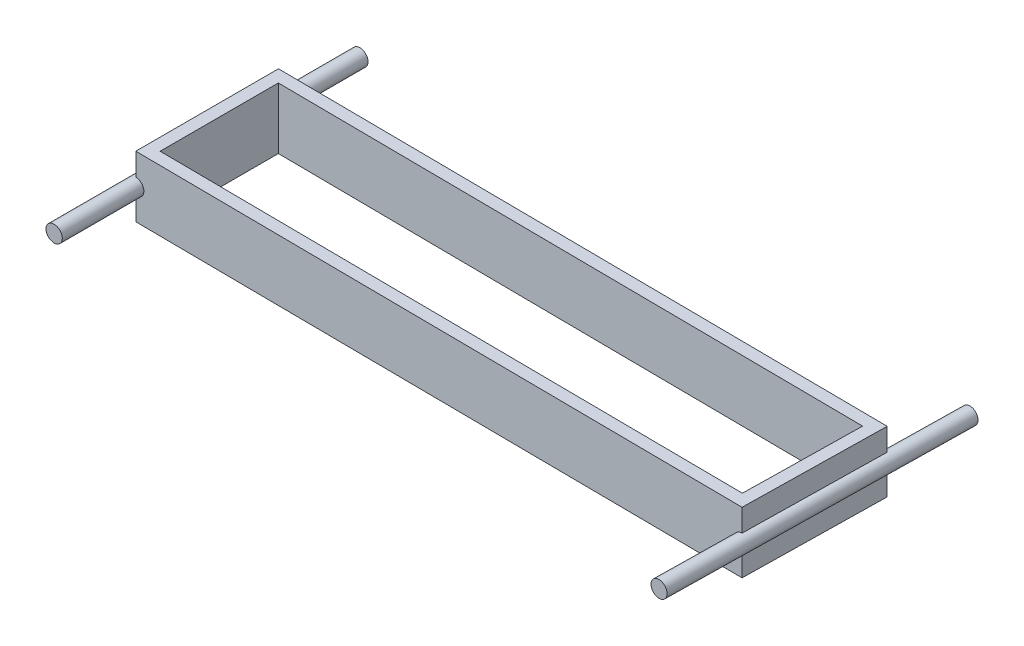
ISO-10303-21;
HEADER;
FILE_DESCRIPTION(('STEP AP214'),'2;1');
FILE_NAME('part.step','',(''),(''),'','','');
FILE_SCHEMA(('AUTOMOTIVE_DESIGN { 1 0 10303 214 1 1 1 1 }'));
ENDSEC;
DATA;
#1=APPLICATION_CONTEXT('core data for automotive mechanical design processes');
#2=APPLICATION_PROTOCOL_DEFINITION('international standard','automotive_design',2000,#1);
#3=PRODUCT_CONTEXT('',#1,'mechanical');
#4=PRODUCT('Part','Part','',(#3));
#5=PRODUCT_RELATED_PRODUCT_CATEGORY('part','',(#4));
#6=PRODUCT_DEFINITION_FORMATION('','',#4);
#7=PRODUCT_DEFINITION_CONTEXT('part definition',#1,'design');
#8=PRODUCT_DEFINITION('design','',#6,#7);
#9=PRODUCT_DEFINITION_SHAPE('','',#8);
#10=(LENGTH_UNIT() NAMED_UNIT(*) SI_UNIT(.MILLI.,.METRE.));
#11=(NAMED_UNIT(*) PLANE_ANGLE_UNIT() SI_UNIT($,.RADIAN.));
#12=(NAMED_UNIT(*) SI_UNIT($,.STERADIAN.) SOLID_ANGLE_UNIT());
#13=UNCERTAINTY_MEASURE_WITH_UNIT(LENGTH_MEASURE(1.E-05),#10,'distance_accuracy_value','');
#14=(GEOMETRIC_REPRESENTATION_CONTEXT(3) GLOBAL_UNCERTAINTY_ASSIGNED_CONTEXT((#13)) GLOBAL_UNIT_ASSIGNED_CONTEXT((#10,
#11,#12)) REPRESENTATION_CONTEXT('',''));
#15=CARTESIAN_POINT('',(0.,0.,0.));
#16=DIRECTION('',(0.,0.,1.));
#17=DIRECTION('',(1.,0.,0.));
#18=AXIS2_PLACEMENT_3D('',#15,#16,#17);
#19=CARTESIAN_POINT('',(57.4764554957129,-38.1,47.6503976005719));
#20=DIRECTION('',(0.99985306122449,0.,0.0171422273936795));
#21=DIRECTION('',(0.0171422273936795,0.,-0.99985306122449));
#22=AXIS2_PLACEMENT_3D('',#19,#20,#21);
#23=PLANE('',#22);
#24=DIRECTION('',(0.0171422273936795,0.,-0.99985306122449));
#25=VECTOR('',#24,1.);
#26=CARTESIAN_POINT('',(56.6045106706446,-24.13,98.5082401983644));
#27=LINE('',#26,#25);
#28=CARTESIAN_POINT('',(57.4764554957129,-24.13,47.6503976005719));
#29=VERTEX_POINT('',#28);
#30=CARTESIAN_POINT('',(59.000399511011,-24.13,-41.2365395422852));
#31=VERTEX_POINT('',#30);
#32=EDGE_CURVE('E137',#29,#31,#27,.T.);
#33=ORIENTED_EDGE('',*,*,#32,.F.);
#34=DIRECTION('',(0.,1.,0.));
#35=VECTOR('',#34,1.);
#36=CARTESIAN_POINT('',(57.4764554957129,-38.1,47.6503976005719));
#37=LINE('',#36,#35);
#38=CARTESIAN_POINT('',(57.4764554957129,-38.1,47.6503976005719));
#39=VERTEX_POINT('',#38);
#40=EDGE_CURVE('E125',#39,#29,#37,.T.);
#41=ORIENTED_EDGE('',*,*,#40,.F.);
#42=DIRECTION('',(0.0171422273936795,0.,-0.99985306122449));
#43=VECTOR('',#42,1.);
#44=CARTESIAN_POINT('',(57.4764554957129,-38.1,47.6503976005719));
#45=LINE('',#44,#43);
#46=CARTESIAN_POINT('',(59.000399511011,-38.1,-41.2365395422852));
#47=VERTEX_POINT('',#46);
#48=EDGE_CURVE('E204',#39,#47,#45,.T.);
#49=ORIENTED_EDGE('',*,*,#48,.T.);
#50=DIRECTION('',(0.,1.,0.));
#51=VECTOR('',#50,1.);
#52=CARTESIAN_POINT('',(59.000399511011,-38.1,-41.2365395422852));
#53=LINE('',#52,#51);
#54=EDGE_CURVE('E138',#47,#31,#53,.T.);
#55=ORIENTED_EDGE('',*,*,#54,.T.);
#56=EDGE_LOOP('',(#33,#41,#49,#55));
#57=FACE_BOUND('',#56,.T.);
#58=ADVANCED_FACE('F36',(#57),#23,.T.);
#59=CARTESIAN_POINT('',(-323.509548328842,-38.1,44.3846833148531));
#60=DIRECTION('',(-1.,0.,0.));
#61=DIRECTION('',(0.,0.,1.));
#62=AXIS2_PLACEMENT_3D('',#59,#60,#61);
#63=PLANE('',#62);
#64=DIRECTION('',(0.,1.,0.));
#65=VECTOR('',#64,1.);
#66=CARTESIAN_POINT('',(-323.509548328842,-38.1,-44.5153166851469));
#67=LINE('',#66,#65);
#68=CARTESIAN_POINT('',(-323.509548328842,-13.97,-44.5153166851469));
#69=VERTEX_POINT('',#68);
#70=CARTESIAN_POINT('',(-323.509548328842,0.,-44.5153166851469));
#71=VERTEX_POINT('',#70);
#72=EDGE_CURVE('E223',#69,#71,#67,.T.);
#73=ORIENTED_EDGE('',*,*,#72,.F.);
#74=DIRECTION('',(0.,0.,-1.));
#75=VECTOR('',#74,1.);
#76=CARTESIAN_POINT('',(-323.509548328842,-13.97,95.25));
#77=LINE('',#76,#75);
#78=CARTESIAN_POINT('',(-323.509548328842,-13.9700000000001,44.3846833148531));
#79=VERTEX_POINT('',#78);
#80=EDGE_CURVE('E160',#69,#79,#77,.F.);
#81=ORIENTED_EDGE('',*,*,#80,.T.);
#82=DIRECTION('',(0.,1.,0.));
#83=VECTOR('',#82,1.);
#84=CARTESIAN_POINT('',(-323.509548328842,-38.1,44.3846833148531));
#85=LINE('',#84,#83);
#86=CARTESIAN_POINT('',(-323.509548328842,0.,44.3846833148531));
#87=VERTEX_POINT('',#86);
#88=EDGE_CURVE('E209',#79,#87,#85,.T.);
#89=ORIENTED_EDGE('',*,*,#88,.T.);
#90=DIRECTION('',(0.,0.,1.));
#91=VECTOR('',#90,1.);
#92=CARTESIAN_POINT('',(-323.509548328842,0.,44.3846833148531));
#93=LINE('',#92,#91);
#94=EDGE_CURVE('E192',#71,#87,#93,.T.);
#95=ORIENTED_EDGE('',*,*,#94,.F.);
#96=EDGE_LOOP('',(#73,#81,#89,#95));
#97=FACE_BOUND('',#96,.T.);
#98=ADVANCED_FACE('F38',(#97),#63,.T.);
#99=CARTESIAN_POINT('',(-323.509548328842,-38.1,44.3846833148531));
#100=VERTEX_POINT('',#99);
#101=CARTESIAN_POINT('',(-323.509548328842,-24.13,44.3846833148531));
#102=VERTEX_POINT('',#101);
#103=EDGE_CURVE('E225',#100,#102,#85,.T.);
#104=ORIENTED_EDGE('',*,*,#103,.T.);
#105=DIRECTION('',(0.,0.,-1.));
#106=VECTOR('',#105,1.);
#107=CARTESIAN_POINT('',(-323.509548328842,-24.13,95.25));
#108=LINE('',#107,#106);
#109=CARTESIAN_POINT('',(-323.509548328842,-24.13,-44.5153166851469));
#110=VERTEX_POINT('',#109);
#111=EDGE_CURVE('E155',#102,#110,#108,.T.);
#112=ORIENTED_EDGE('',*,*,#111,.T.);
#113=CARTESIAN_POINT('',(-323.509548328842,-38.1,-44.5153166851469));
#114=VERTEX_POINT('',#113);
#115=EDGE_CURVE('E220',#114,#110,#67,.T.);
#116=ORIENTED_EDGE('',*,*,#115,.F.);
#117=DIRECTION('',(0.,0.,1.));
#118=VECTOR('',#117,1.);
#119=CARTESIAN_POINT('',(-323.509548328842,-38.1,44.3846833148531));
#120=LINE('',#119,#118);
#121=EDGE_CURVE('E199',#114,#100,#120,.T.);
#122=ORIENTED_EDGE('',*,*,#121,.T.);
#123=EDGE_LOOP('',(#104,#112,#116,#122));
#124=FACE_BOUND('',#123,.T.);
#125=ADVANCED_FACE('F232',(#124),#63,.T.);
#126=CARTESIAN_POINT('',(-323.509548328842,-38.1,-44.5153166851469));
#127=DIRECTION('',(0.00857142857144036,0.,-0.999963264631379));
#128=DIRECTION('',(-0.999963264631379,0.,-0.00857142857144036));
#129=AXIS2_PLACEMENT_3D('',#126,#127,#128);
#130=PLANE('',#129);
#131=CARTESIAN_POINT('',(59.0003995110107,-19.05,-41.2365395422852));
#132=DIRECTION('',(0.00857142857144036,0.,-0.999963264631379));
#133=DIRECTION('',(0.999963264631379,0.,0.00857142857144036));
#134=AXIS2_PLACEMENT_3D('',#131,#132,#133);
#135=ELLIPSE('',#134,5.0801866225282,5.07999999999996);
#136=CARTESIAN_POINT('',(59.000399511011,-13.97,-41.2365395422852));
#137=VERTEX_POINT('',#136);
#138=EDGE_CURVE('E58',#31,#137,#135,.T.);
#139=ORIENTED_EDGE('',*,*,#138,.F.);
#140=ORIENTED_EDGE('',*,*,#54,.F.);
#141=DIRECTION('',(-0.999963264631379,0.,-0.00857142857144036));
#142=VECTOR('',#141,1.);
#143=CARTESIAN_POINT('',(-323.509548328842,-38.1,-44.5153166851469));
#144=LINE('',#143,#142);
#145=EDGE_CURVE('E206',#47,#114,#144,.T.);
#146=ORIENTED_EDGE('',*,*,#145,.T.);
#147=ORIENTED_EDGE('',*,*,#115,.T.);
#148=CARTESIAN_POINT('',(-323.509548328842,-19.05,-44.5153166851469));
#149=DIRECTION('',(0.00857142857144036,0.,-0.999963264631379));
#150=DIRECTION('',(-0.999963264631379,0.,-0.00857142857144036));
#151=AXIS2_PLACEMENT_3D('',#148,#149,#150);
#152=ELLIPSE('',#151,5.08018662252821,5.07999999999996);
#153=EDGE_CURVE('E163',#110,#69,#152,.F.);
#154=ORIENTED_EDGE('',*,*,#153,.T.);
#155=ORIENTED_EDGE('',*,*,#72,.T.);
#156=DIRECTION('',(-0.999963264631379,0.,-0.00857142857144036));
#157=VECTOR('',#156,1.);
#158=CARTESIAN_POINT('',(-323.509548328842,0.,-44.5153166851469));
#159=LINE('',#158,#157);
#160=CARTESIAN_POINT('',(59.000399511011,0.,-41.2365395422852));
#161=VERTEX_POINT('',#160);
#162=EDGE_CURVE('E202',#161,#71,#159,.T.);
#163=ORIENTED_EDGE('',*,*,#162,.F.);
#164=EDGE_CURVE('E133',#137,#161,#53,.T.);
#165=ORIENTED_EDGE('',*,*,#164,.F.);
#166=EDGE_LOOP('',(#139,#140,#146,#147,#154,#155,#163,#165));
#167=FACE_BOUND('',#166,.T.);
#168=ADVANCED_FACE('F237',(#167),#130,.T.);
#169=DIRECTION('',(0.0171422273936795,0.,-0.99985306122449));
#170=VECTOR('',#169,1.);
#171=CARTESIAN_POINT('',(56.6045106706446,-13.97,98.5082401983644));
#172=LINE('',#171,#170);
#173=CARTESIAN_POINT('',(57.4764554957129,-13.9700000000001,47.6503976005719));
#174=VERTEX_POINT('',#173);
#175=EDGE_CURVE('E51',#137,#174,#172,.F.);
#176=ORIENTED_EDGE('',*,*,#175,.F.);
#177=ORIENTED_EDGE('',*,*,#164,.T.);
#178=DIRECTION('',(0.0171422273936795,0.,-0.99985306122449));
#179=VECTOR('',#178,1.);
#180=CARTESIAN_POINT('',(57.4764554957129,0.,47.6503976005719));
#181=LINE('',#180,#179);
#182=CARTESIAN_POINT('',(57.4764554957129,0.,47.6503976005719));
#183=VERTEX_POINT('',#182);
#184=EDGE_CURVE('E215',#183,#161,#181,.T.);
#185=ORIENTED_EDGE('',*,*,#184,.F.);
#186=EDGE_CURVE('E134',#174,#183,#37,.T.);
#187=ORIENTED_EDGE('',*,*,#186,.F.);
#188=EDGE_LOOP('',(#176,#177,#185,#187));
#189=FACE_BOUND('',#188,.T.);
#190=ADVANCED_FACE('F245',(#189),#23,.T.);
#191=CARTESIAN_POINT('',(-323.509548328842,-38.1,44.3846833148531));
#192=DIRECTION('',(-0.00857142857144038,0.,0.999963264631379));
#193=DIRECTION('',(0.999963264631379,0.,0.00857142857144038));
#194=AXIS2_PLACEMENT_3D('',#191,#192,#193);
#195=PLANE('',#194);
#196=CARTESIAN_POINT('',(57.4764554957126,-19.05,47.6503976005719));
#197=DIRECTION('',(-0.00857142857144038,0.,0.999963264631379));
#198=DIRECTION('',(0.999963264631379,0.,0.00857142857144038));
#199=AXIS2_PLACEMENT_3D('',#196,#197,#198);
#200=ELLIPSE('',#199,5.0801866225282,5.07999999999996);
#201=EDGE_CURVE('E11',#174,#29,#200,.T.);
#202=ORIENTED_EDGE('',*,*,#201,.F.);
#203=ORIENTED_EDGE('',*,*,#186,.T.);
#204=DIRECTION('',(0.999963264631379,0.,0.00857142857144038));
#205=VECTOR('',#204,1.);
#206=CARTESIAN_POINT('',(-323.509548328842,0.,44.3846833148531));
#207=LINE('',#206,#205);
#208=EDGE_CURVE('E212',#87,#183,#207,.T.);
#209=ORIENTED_EDGE('',*,*,#208,.F.);
#210=ORIENTED_EDGE('',*,*,#88,.F.);
#211=CARTESIAN_POINT('',(-323.509548328842,-19.05,44.3846833148531));
#212=DIRECTION('',(-0.00857142857144038,0.,0.999963264631379));
#213=DIRECTION('',(-0.999963264631379,0.,-0.00857142857144038));
#214=AXIS2_PLACEMENT_3D('',#211,#212,#213);
#215=ELLIPSE('',#214,5.08018662252821,5.07999999999996);
#216=EDGE_CURVE('E44',#79,#102,#215,.F.);
#217=ORIENTED_EDGE('',*,*,#216,.T.);
#218=ORIENTED_EDGE('',*,*,#103,.F.);
#219=DIRECTION('',(0.999963264631379,0.,0.00857142857144038));
#220=VECTOR('',#219,1.);
#221=CARTESIAN_POINT('',(-323.509548328842,-38.1,44.3846833148531));
#222=LINE('',#221,#220);
#223=EDGE_CURVE('E129',#100,#39,#222,.T.);
#224=ORIENTED_EDGE('',*,*,#223,.T.);
#225=ORIENTED_EDGE('',*,*,#40,.T.);
#226=EDGE_LOOP('',(#202,#203,#209,#210,#217,#218,#224,#225));
#227=FACE_BOUND('',#226,.T.);
#228=ADVANCED_FACE('F127',(#227),#195,.T.);
#229=CARTESIAN_POINT('',(0.,-38.1,0.));
#230=DIRECTION('',(0.,-1.,0.));
#231=DIRECTION('',(0.,0.,-1.));
#232=AXIS2_PLACEMENT_3D('',#229,#230,#231);
#233=PLANE('',#232);
#234=DIRECTION('',(0.,0.,1.));
#235=VECTOR('',#234,1.);
#236=CARTESIAN_POINT('',(-315.889548328842,-38.1,36.8297200662076));
#237=LINE('',#236,#235);
#238=CARTESIAN_POINT('',(-315.889548328842,-38.1,-36.8297200662076));
#239=VERTEX_POINT('',#238);
#240=CARTESIAN_POINT('',(-315.889548328842,-38.1,36.8297200662076));
#241=VERTEX_POINT('',#240);
#242=EDGE_CURVE('E167',#239,#241,#237,.T.);
#243=ORIENTED_EDGE('',*,*,#242,.T.);
#244=DIRECTION('',(0.999963264631379,0.,0.00857142857144039));
#245=VECTOR('',#244,1.);
#246=CARTESIAN_POINT('',(-315.889548328842,-38.1,36.8297200662076));
#247=LINE('',#246,#245);
#248=CARTESIAN_POINT('',(49.9870840671414,-38.1,39.9659206962352));
#249=VERTEX_POINT('',#248);
#250=EDGE_CURVE('E170',#241,#249,#247,.T.);
#251=ORIENTED_EDGE('',*,*,#250,.T.);
#252=DIRECTION('',(0.0171422273936795,0.,-0.99985306122449));
#253=VECTOR('',#252,1.);
#254=CARTESIAN_POINT('',(49.9870840671414,-38.1,39.9659206962352));
#255=LINE('',#254,#253);
#256=CARTESIAN_POINT('',(51.2497709395824,-38.1,-33.6826960082423));
#257=VERTEX_POINT('',#256);
#258=EDGE_CURVE('E174',#249,#257,#255,.T.);
#259=ORIENTED_EDGE('',*,*,#258,.T.);
#260=DIRECTION('',(-0.999963264631379,0.,-0.00857142857144037));
#261=VECTOR('',#260,1.);
#262=CARTESIAN_POINT('',(-315.889548328842,-38.1,-36.8297200662076));
#263=LINE('',#262,#261);
#264=EDGE_CURVE('E177',#257,#239,#263,.T.);
#265=ORIENTED_EDGE('',*,*,#264,.T.);
#266=EDGE_LOOP('',(#243,#251,#259,#265));
#267=FACE_BOUND('',#266,.T.);
#268=ORIENTED_EDGE('',*,*,#121,.F.);
#269=ORIENTED_EDGE('',*,*,#145,.F.);
#270=ORIENTED_EDGE('',*,*,#48,.F.);
#271=ORIENTED_EDGE('',*,*,#223,.F.);
#272=EDGE_LOOP('',(#268,#269,#270,#271));
#273=FACE_BOUND('',#272,.T.);
#274=ADVANCED_FACE('F236',(#267,#273),#233,.T.);
#275=CARTESIAN_POINT('',(0.,0.,0.));
#276=DIRECTION('',(0.,-1.,0.));
#277=DIRECTION('',(0.,0.,-1.));
#278=AXIS2_PLACEMENT_3D('',#275,#276,#277);
#279=PLANE('',#278);
#280=DIRECTION('',(0.999963264631379,0.,0.00857142857144039));
#281=VECTOR('',#280,1.);
#282=CARTESIAN_POINT('',(-315.889548328842,0.,36.8297200662076));
#283=LINE('',#282,#281);
#284=CARTESIAN_POINT('',(-315.889548328842,0.,36.8297200662076));
#285=VERTEX_POINT('',#284);
#286=CARTESIAN_POINT('',(49.9870840671414,0.,39.9659206962352));
#287=VERTEX_POINT('',#286);
#288=EDGE_CURVE('E182',#285,#287,#283,.T.);
#289=ORIENTED_EDGE('',*,*,#288,.F.);
#290=DIRECTION('',(0.,0.,1.));
#291=VECTOR('',#290,1.);
#292=CARTESIAN_POINT('',(-315.889548328842,0.,36.8297200662076));
#293=LINE('',#292,#291);
#294=CARTESIAN_POINT('',(-315.889548328842,0.,-36.8297200662076));
#295=VERTEX_POINT('',#294);
#296=EDGE_CURVE('E166',#295,#285,#293,.T.);
#297=ORIENTED_EDGE('',*,*,#296,.F.);
#298=DIRECTION('',(-0.999963264631379,0.,-0.00857142857144037));
#299=VECTOR('',#298,1.);
#300=CARTESIAN_POINT('',(-315.889548328842,0.,-36.8297200662076));
#301=LINE('',#300,#299);
#302=CARTESIAN_POINT('',(51.2497709395824,0.,-33.6826960082423));
#303=VERTEX_POINT('',#302);
#304=EDGE_CURVE('E171',#303,#295,#301,.T.);
#305=ORIENTED_EDGE('',*,*,#304,.F.);
#306=DIRECTION('',(0.0171422273936795,0.,-0.99985306122449));
#307=VECTOR('',#306,1.);
#308=CARTESIAN_POINT('',(49.9870840671414,0.,39.9659206962352));
#309=LINE('',#308,#307);
#310=EDGE_CURVE('E185',#287,#303,#309,.T.);
#311=ORIENTED_EDGE('',*,*,#310,.F.);
#312=EDGE_LOOP('',(#289,#297,#305,#311));
#313=FACE_BOUND('',#312,.T.);
#314=ORIENTED_EDGE('',*,*,#94,.T.);
#315=ORIENTED_EDGE('',*,*,#208,.T.);
#316=ORIENTED_EDGE('',*,*,#184,.T.);
#317=ORIENTED_EDGE('',*,*,#162,.T.);
#318=EDGE_LOOP('',(#314,#315,#316,#317));
#319=FACE_BOUND('',#318,.T.);
#320=ADVANCED_FACE('F243',(#313,#319),#279,.F.);
#321=CARTESIAN_POINT('',(-315.889548328842,-38.1,36.8297200662076));
#322=DIRECTION('',(-1.,0.,0.));
#323=DIRECTION('',(0.,0.,1.));
#324=AXIS2_PLACEMENT_3D('',#321,#322,#323);
#325=PLANE('',#324);
#326=ORIENTED_EDGE('',*,*,#296,.T.);
#327=DIRECTION('',(0.,1.,0.));
#328=VECTOR('',#327,1.);
#329=CARTESIAN_POINT('',(-315.889548328842,-38.1,36.8297200662076));
#330=LINE('',#329,#328);
#331=EDGE_CURVE('E180',#241,#285,#330,.T.);
#332=ORIENTED_EDGE('',*,*,#331,.F.);
#333=ORIENTED_EDGE('',*,*,#242,.F.);
#334=DIRECTION('',(0.,1.,0.));
#335=VECTOR('',#334,1.);
#336=CARTESIAN_POINT('',(-315.889548328842,-38.1,-36.8297200662076));
#337=LINE('',#336,#335);
#338=EDGE_CURVE('E190',#239,#295,#337,.T.);
#339=ORIENTED_EDGE('',*,*,#338,.T.);
#340=EDGE_LOOP('',(#326,#332,#333,#339));
#341=FACE_BOUND('',#340,.T.);
#342=ADVANCED_FACE('F332',(#341),#325,.F.);
#343=CARTESIAN_POINT('',(-315.889548328842,-38.1,-36.8297200662076));
#344=DIRECTION('',(0.00857142857144037,0.,-0.999963264631379));
#345=DIRECTION('',(-0.999963264631379,0.,-0.00857142857144037));
#346=AXIS2_PLACEMENT_3D('',#343,#344,#345);
#347=PLANE('',#346);
#348=ORIENTED_EDGE('',*,*,#304,.T.);
#349=ORIENTED_EDGE('',*,*,#338,.F.);
#350=ORIENTED_EDGE('',*,*,#264,.F.);
#351=DIRECTION('',(0.,1.,0.));
#352=VECTOR('',#351,1.);
#353=CARTESIAN_POINT('',(51.2497709395824,-38.1,-33.6826960082423));
#354=LINE('',#353,#352);
#355=EDGE_CURVE('E193',#257,#303,#354,.T.);
#356=ORIENTED_EDGE('',*,*,#355,.T.);
#357=EDGE_LOOP('',(#348,#349,#350,#356));
#358=FACE_BOUND('',#357,.T.);
#359=ADVANCED_FACE('F328',(#358),#347,.F.);
#360=CARTESIAN_POINT('',(49.9870840671414,-38.1,39.9659206962352));
#361=DIRECTION('',(0.99985306122449,0.,0.0171422273936795));
#362=DIRECTION('',(0.0171422273936795,0.,-0.99985306122449));
#363=AXIS2_PLACEMENT_3D('',#360,#361,#362);
#364=PLANE('',#363);
#365=ORIENTED_EDGE('',*,*,#310,.T.);
#366=ORIENTED_EDGE('',*,*,#355,.F.);
#367=ORIENTED_EDGE('',*,*,#258,.F.);
#368=DIRECTION('',(0.,1.,0.));
#369=VECTOR('',#368,1.);
#370=CARTESIAN_POINT('',(49.9870840671414,-38.1,39.9659206962352));
#371=LINE('',#370,#369);
#372=EDGE_CURVE('E195',#249,#287,#371,.T.);
#373=ORIENTED_EDGE('',*,*,#372,.T.);
#374=EDGE_LOOP('',(#365,#366,#367,#373));
#375=FACE_BOUND('',#374,.T.);
#376=ADVANCED_FACE('F331',(#375),#364,.F.);
#377=CARTESIAN_POINT('',(-315.889548328842,-38.1,36.8297200662076));
#378=DIRECTION('',(-0.00857142857144039,0.,0.999963264631379));
#379=DIRECTION('',(0.999963264631379,0.,0.00857142857144039));
#380=AXIS2_PLACEMENT_3D('',#377,#378,#379);
#381=PLANE('',#380);
#382=ORIENTED_EDGE('',*,*,#288,.T.);
#383=ORIENTED_EDGE('',*,*,#372,.F.);
#384=ORIENTED_EDGE('',*,*,#250,.F.);
#385=ORIENTED_EDGE('',*,*,#331,.T.);
#386=EDGE_LOOP('',(#382,#383,#384,#385));
#387=FACE_BOUND('',#386,.T.);
#388=ADVANCED_FACE('F327',(#387),#381,.F.);
#389=CARTESIAN_POINT('',(-323.509548328842,-19.05,95.25));
#390=DIRECTION('',(0.,0.,-1.));
#391=DIRECTION('',(-1.,0.,0.));
#392=AXIS2_PLACEMENT_3D('',#389,#390,#391);
#393=CYLINDRICAL_SURFACE('',#392,5.07999999999996);
#394=ORIENTED_EDGE('',*,*,#153,.F.);
#395=ORIENTED_EDGE('',*,*,#111,.F.);
#396=ORIENTED_EDGE('',*,*,#216,.F.);
#397=ORIENTED_EDGE('',*,*,#80,.F.);
#398=EDGE_LOOP('',(#394,#395,#396,#397));
#399=FACE_BOUND('',#398,.T.);
#400=CARTESIAN_POINT('',(-323.509548328842,-19.05,95.25));
#401=DIRECTION('',(0.,0.,1.));
#402=DIRECTION('',(1.,0.,0.));
#403=AXIS2_PLACEMENT_3D('',#400,#401,#402);
#404=CIRCLE('',#403,5.07999999999996);
#405=CARTESIAN_POINT('',(-318.429548328842,-19.05,95.25));
#406=VERTEX_POINT('',#405);
#407=EDGE_CURVE('E152',#406,#406,#404,.T.);
#408=ORIENTED_EDGE('',*,*,#407,.F.);
#409=EDGE_LOOP('',(#408));
#410=FACE_BOUND('',#409,.T.);
#411=CARTESIAN_POINT('',(-323.509548328842,-19.05,-95.25));
#412=DIRECTION('',(0.,0.,1.));
#413=DIRECTION('',(1.,0.,0.));
#414=AXIS2_PLACEMENT_3D('',#411,#412,#413);
#415=CIRCLE('',#414,5.07999999999996);
#416=CARTESIAN_POINT('',(-318.429548328842,-19.05,-95.25));
#417=VERTEX_POINT('',#416);
#418=EDGE_CURVE('E151',#417,#417,#415,.T.);
#419=ORIENTED_EDGE('',*,*,#418,.T.);
#420=EDGE_LOOP('',(#419));
#421=FACE_BOUND('',#420,.T.);
#422=ADVANCED_FACE('F321',(#399,#410,#421),#393,.T.);
#423=CARTESIAN_POINT('',(-323.509548328842,-19.05,95.25));
#424=DIRECTION('',(0.,0.,1.));
#425=DIRECTION('',(1.,0.,0.));
#426=AXIS2_PLACEMENT_3D('',#423,#424,#425);
#427=PLANE('',#426);
#428=ORIENTED_EDGE('',*,*,#407,.T.);
#429=EDGE_LOOP('',(#428));
#430=FACE_BOUND('',#429,.T.);
#431=ADVANCED_FACE('F318',(#430),#427,.T.);
#432=CARTESIAN_POINT('',(-323.509548328842,-19.05,-95.25));
#433=DIRECTION('',(0.,0.,1.));
#434=DIRECTION('',(1.,0.,0.));
#435=AXIS2_PLACEMENT_3D('',#432,#433,#434);
#436=PLANE('',#435);
#437=ORIENTED_EDGE('',*,*,#418,.F.);
#438=EDGE_LOOP('',(#437));
#439=FACE_BOUND('',#438,.T.);
#440=ADVANCED_FACE('F292',(#439),#436,.F.);
#441=CARTESIAN_POINT('',(56.6045106706444,-19.05,98.5082401983644));
#442=DIRECTION('',(0.0171422273936795,0.,-0.99985306122449));
#443=DIRECTION('',(-0.99985306122449,0.,-0.0171422273936795));
#444=AXIS2_PLACEMENT_3D('',#441,#442,#443);
#445=CYLINDRICAL_SURFACE('',#444,5.07999999999996);
#446=ORIENTED_EDGE('',*,*,#32,.T.);
#447=ORIENTED_EDGE('',*,*,#138,.T.);
#448=ORIENTED_EDGE('',*,*,#175,.T.);
#449=ORIENTED_EDGE('',*,*,#201,.T.);
#450=EDGE_LOOP('',(#446,#447,#448,#449));
#451=FACE_BOUND('',#450,.T.);
#452=CARTESIAN_POINT('',(56.6045106706444,-19.05,98.5082401983644));
#453=DIRECTION('',(0.0171422273936795,0.,-0.99985306122449));
#454=DIRECTION('',(-0.99985306122449,0.,-0.0171422273936795));
#455=AXIS2_PLACEMENT_3D('',#452,#453,#454);
#456=CIRCLE('',#455,5.07999999999996);
#457=CARTESIAN_POINT('',(51.525257119624,-19.05,98.4211576832045));
#458=VERTEX_POINT('',#457);
#459=EDGE_CURVE('E143',#458,#458,#456,.T.);
#460=ORIENTED_EDGE('',*,*,#459,.T.);
#461=EDGE_LOOP('',(#460));
#462=FACE_BOUND('',#461,.T.);
#463=CARTESIAN_POINT('',(59.8701049891403,-19.05,-91.9637679649009));
#464=DIRECTION('',(0.0171422273936795,0.,-0.99985306122449));
#465=DIRECTION('',(-0.99985306122449,0.,-0.0171422273936795));
#466=AXIS2_PLACEMENT_3D('',#463,#464,#465);
#467=CIRCLE('',#466,5.07999999999996);
#468=CARTESIAN_POINT('',(54.7908514381199,-19.05,-92.0508504800608));
#469=VERTEX_POINT('',#468);
#470=EDGE_CURVE('E146',#469,#469,#467,.T.);
#471=ORIENTED_EDGE('',*,*,#470,.F.);
#472=EDGE_LOOP('',(#471));
#473=FACE_BOUND('',#472,.T.);
#474=ADVANCED_FACE('F141',(#451,#462,#473),#445,.T.);
#475=CARTESIAN_POINT('',(56.6045106706444,-19.05,98.5082401983644));
#476=DIRECTION('',(-0.0171422273936795,0.,0.99985306122449));
#477=DIRECTION('',(-0.99985306122449,0.,-0.0171422273936795));
#478=AXIS2_PLACEMENT_3D('',#475,#476,#477);
#479=PLANE('',#478);
#480=ORIENTED_EDGE('',*,*,#459,.F.);
#481=EDGE_LOOP('',(#480));
#482=FACE_BOUND('',#481,.T.);
#483=ADVANCED_FACE('F291',(#482),#479,.T.);
#484=CARTESIAN_POINT('',(59.8701049891403,-19.05,-91.9637679649009));
#485=DIRECTION('',(-0.0171422273936795,0.,0.99985306122449));
#486=DIRECTION('',(-0.99985306122449,0.,-0.0171422273936795));
#487=AXIS2_PLACEMENT_3D('',#484,#485,#486);
#488=PLANE('',#487);
#489=ORIENTED_EDGE('',*,*,#470,.T.);
#490=EDGE_LOOP('',(#489));
#491=FACE_BOUND('',#490,.T.);
#492=ADVANCED_FACE('F302',(#491),#488,.F.);
#493=CLOSED_SHELL('',(#58,#98,#125,#168,#190,#228,#274,#320,#342,#359,#376,#388,#422,#431,#440,
#474,#483,#492));
#494=MANIFOLD_SOLID_BREP('B2',#493);
#495=ADVANCED_BREP_SHAPE_REPRESENTATION('',(#18,#494),#14);
#496=SHAPE_DEFINITION_REPRESENTATION(#9,#495);
ENDSEC;
END-ISO-10303-21;
